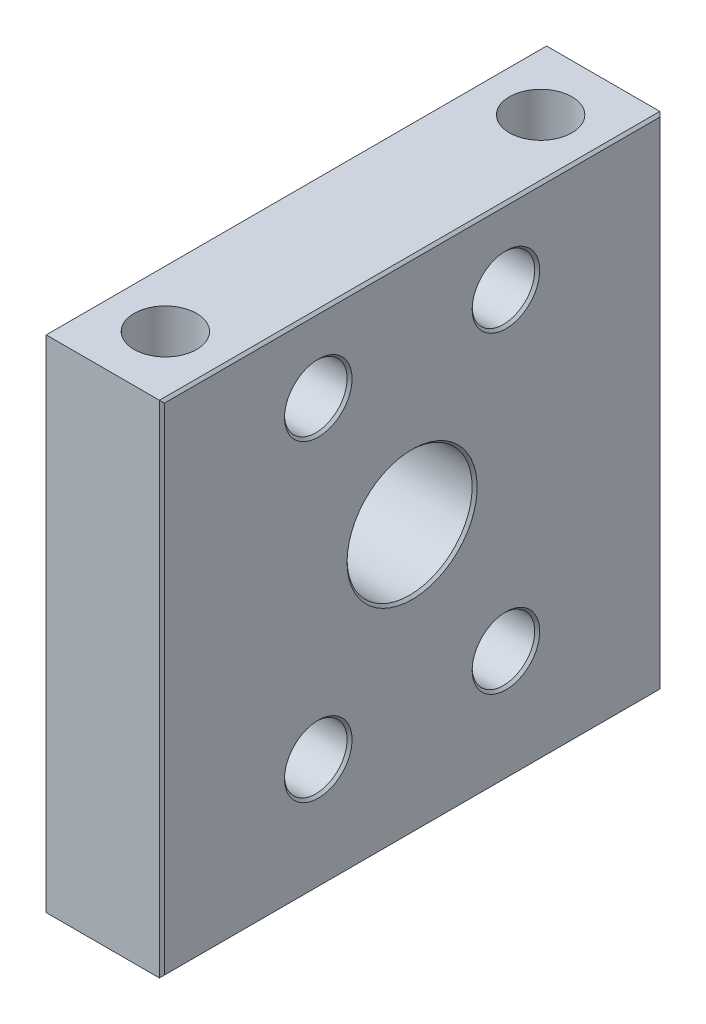
ISO-10303-21;
HEADER;
FILE_DESCRIPTION(('STEP AP214'),'2;1');
FILE_NAME('part.step','',(''),(''),'','','');
FILE_SCHEMA(('AUTOMOTIVE_DESIGN { 1 0 10303 214 1 1 1 1 }'));
ENDSEC;
DATA;
#1=APPLICATION_CONTEXT('core data for automotive mechanical design processes');
#2=APPLICATION_PROTOCOL_DEFINITION('international standard','automotive_design',2000,#1);
#3=PRODUCT_CONTEXT('',#1,'mechanical');
#4=PRODUCT('Part','Part','',(#3));
#5=PRODUCT_RELATED_PRODUCT_CATEGORY('part','',(#4));
#6=PRODUCT_DEFINITION_FORMATION('','',#4);
#7=PRODUCT_DEFINITION_CONTEXT('part definition',#1,'design');
#8=PRODUCT_DEFINITION('design','',#6,#7);
#9=PRODUCT_DEFINITION_SHAPE('','',#8);
#10=(LENGTH_UNIT() NAMED_UNIT(*) SI_UNIT(.MILLI.,.METRE.));
#11=(NAMED_UNIT(*) PLANE_ANGLE_UNIT() SI_UNIT($,.RADIAN.));
#12=(NAMED_UNIT(*) SI_UNIT($,.STERADIAN.) SOLID_ANGLE_UNIT());
#13=UNCERTAINTY_MEASURE_WITH_UNIT(LENGTH_MEASURE(1.E-05),#10,'distance_accuracy_value','');
#14=(GEOMETRIC_REPRESENTATION_CONTEXT(3) GLOBAL_UNCERTAINTY_ASSIGNED_CONTEXT((#13)) GLOBAL_UNIT_ASSIGNED_CONTEXT((#10,
#11,#12)) REPRESENTATION_CONTEXT('',''));
#15=CARTESIAN_POINT('',(0.,0.,0.));
#16=DIRECTION('',(0.,0.,1.));
#17=DIRECTION('',(1.,0.,0.));
#18=AXIS2_PLACEMENT_3D('',#15,#16,#17);
#19=CARTESIAN_POINT('',(0.,50.8,0.));
#20=DIRECTION('',(0.,1.,0.));
#21=DIRECTION('',(0.,0.,1.));
#22=AXIS2_PLACEMENT_3D('',#19,#20,#21);
#23=PLANE('',#22);
#24=CARTESIAN_POINT('',(0.,50.8,-19.05));
#25=DIRECTION('',(0.,1.,0.));
#26=DIRECTION('',(0.,0.,1.));
#27=AXIS2_PLACEMENT_3D('',#24,#25,#26);
#28=CIRCLE('',#27,3.175);
#29=CARTESIAN_POINT('',(0.,50.8,-15.875));
#30=VERTEX_POINT('',#29);
#31=EDGE_CURVE('E245',#30,#30,#28,.T.);
#32=ORIENTED_EDGE('',*,*,#31,.F.);
#33=EDGE_LOOP('',(#32));
#34=FACE_BOUND('',#33,.T.);
#35=DIRECTION('',(-1.,0.,0.));
#36=VECTOR('',#35,1.);
#37=CARTESIAN_POINT('',(6.00095142318896,50.8,-25.4));
#38=LINE('',#37,#36);
#39=CARTESIAN_POINT('',(5.74695142318896,50.8,-25.4));
#40=VERTEX_POINT('',#39);
#41=CARTESIAN_POINT('',(-5.74695142318896,50.8,-25.4));
#42=VERTEX_POINT('',#41);
#43=EDGE_CURVE('E234',#40,#42,#38,.T.);
#44=ORIENTED_EDGE('',*,*,#43,.T.);
#45=DIRECTION('',(0.,0.,1.));
#46=VECTOR('',#45,1.);
#47=CARTESIAN_POINT('',(-5.74695142318896,50.8,25.4));
#48=LINE('',#47,#46);
#49=CARTESIAN_POINT('',(-5.74695142318896,50.8,25.4));
#50=VERTEX_POINT('',#49);
#51=EDGE_CURVE('E145',#42,#50,#48,.T.);
#52=ORIENTED_EDGE('',*,*,#51,.T.);
#53=DIRECTION('',(1.,0.,0.));
#54=VECTOR('',#53,1.);
#55=CARTESIAN_POINT('',(6.00095142318896,50.8,25.4));
#56=LINE('',#55,#54);
#57=CARTESIAN_POINT('',(5.74695142318896,50.8,25.4));
#58=VERTEX_POINT('',#57);
#59=EDGE_CURVE('E240',#50,#58,#56,.T.);
#60=ORIENTED_EDGE('',*,*,#59,.T.);
#61=DIRECTION('',(0.,0.,-1.));
#62=VECTOR('',#61,1.);
#63=CARTESIAN_POINT('',(5.74695142318896,50.8,-25.4));
#64=LINE('',#63,#62);
#65=EDGE_CURVE('E143',#58,#40,#64,.T.);
#66=ORIENTED_EDGE('',*,*,#65,.T.);
#67=EDGE_LOOP('',(#44,#52,#60,#66));
#68=FACE_BOUND('',#67,.T.);
#69=CARTESIAN_POINT('',(0.,50.8,19.05));
#70=DIRECTION('',(0.,1.,0.));
#71=DIRECTION('',(0.,0.,1.));
#72=AXIS2_PLACEMENT_3D('',#69,#70,#71);
#73=CIRCLE('',#72,3.175);
#74=CARTESIAN_POINT('',(0.,50.8,22.225));
#75=VERTEX_POINT('',#74);
#76=EDGE_CURVE('E276',#75,#75,#73,.T.);
#77=ORIENTED_EDGE('',*,*,#76,.F.);
#78=EDGE_LOOP('',(#77));
#79=FACE_BOUND('',#78,.T.);
#80=ADVANCED_FACE('F44',(#34,#68,#79),#23,.T.);
#81=CARTESIAN_POINT('',(0.,0.,0.));
#82=DIRECTION('',(0.,1.,0.));
#83=DIRECTION('',(0.,0.,1.));
#84=AXIS2_PLACEMENT_3D('',#81,#82,#83);
#85=PLANE('',#84);
#86=DIRECTION('',(1.,0.,0.));
#87=VECTOR('',#86,1.);
#88=CARTESIAN_POINT('',(6.00095142318896,0.,25.4));
#89=LINE('',#88,#87);
#90=CARTESIAN_POINT('',(-5.74695142318896,0.,25.4));
#91=VERTEX_POINT('',#90);
#92=CARTESIAN_POINT('',(5.74695142318896,0.,25.4));
#93=VERTEX_POINT('',#92);
#94=EDGE_CURVE('E241',#91,#93,#89,.T.);
#95=ORIENTED_EDGE('',*,*,#94,.F.);
#96=DIRECTION('',(0.,0.,-1.));
#97=VECTOR('',#96,1.);
#98=CARTESIAN_POINT('',(-5.74695142318896,0.,0.));
#99=LINE('',#98,#97);
#100=CARTESIAN_POINT('',(-5.74695142318896,0.,-25.4));
#101=VERTEX_POINT('',#100);
#102=EDGE_CURVE('E154',#91,#101,#99,.T.);
#103=ORIENTED_EDGE('',*,*,#102,.T.);
#104=DIRECTION('',(-1.,0.,0.));
#105=VECTOR('',#104,1.);
#106=CARTESIAN_POINT('',(6.00095142318896,0.,-25.4));
#107=LINE('',#106,#105);
#108=CARTESIAN_POINT('',(5.74695142318896,0.,-25.4));
#109=VERTEX_POINT('',#108);
#110=EDGE_CURVE('E232',#109,#101,#107,.T.);
#111=ORIENTED_EDGE('',*,*,#110,.F.);
#112=DIRECTION('',(0.,0.,1.));
#113=VECTOR('',#112,1.);
#114=CARTESIAN_POINT('',(5.74695142318896,0.,0.));
#115=LINE('',#114,#113);
#116=EDGE_CURVE('E152',#109,#93,#115,.T.);
#117=ORIENTED_EDGE('',*,*,#116,.T.);
#118=EDGE_LOOP('',(#95,#103,#111,#117));
#119=FACE_BOUND('',#118,.T.);
#120=CARTESIAN_POINT('',(0.,0.,-19.05));
#121=DIRECTION('',(0.,1.,0.));
#122=DIRECTION('',(0.,0.,1.));
#123=AXIS2_PLACEMENT_3D('',#120,#121,#122);
#124=CIRCLE('',#123,3.175);
#125=CARTESIAN_POINT('',(0.,0.,-15.875));
#126=VERTEX_POINT('',#125);
#127=EDGE_CURVE('E273',#126,#126,#124,.T.);
#128=ORIENTED_EDGE('',*,*,#127,.T.);
#129=EDGE_LOOP('',(#128));
#130=FACE_BOUND('',#129,.T.);
#131=CARTESIAN_POINT('',(0.,0.,19.05));
#132=DIRECTION('',(0.,1.,0.));
#133=DIRECTION('',(0.,0.,1.));
#134=AXIS2_PLACEMENT_3D('',#131,#132,#133);
#135=CIRCLE('',#134,3.175);
#136=CARTESIAN_POINT('',(0.,0.,22.225));
#137=VERTEX_POINT('',#136);
#138=EDGE_CURVE('E210',#137,#137,#135,.T.);
#139=ORIENTED_EDGE('',*,*,#138,.T.);
#140=EDGE_LOOP('',(#139));
#141=FACE_BOUND('',#140,.T.);
#142=ADVANCED_FACE('F237',(#119,#130,#141),#85,.F.);
#143=CARTESIAN_POINT('',(-6.00095142318896,50.8,25.4));
#144=DIRECTION('',(1.,0.,0.));
#145=DIRECTION('',(0.,0.,-1.));
#146=AXIS2_PLACEMENT_3D('',#143,#144,#145);
#147=PLANE('',#146);
#148=DIRECTION('',(0.,0.,-1.));
#149=VECTOR('',#148,1.);
#150=CARTESIAN_POINT('',(-6.00095142318896,50.546,-25.4));
#151=LINE('',#150,#149);
#152=CARTESIAN_POINT('',(-6.00095142318896,50.546,25.146));
#153=VERTEX_POINT('',#152);
#154=CARTESIAN_POINT('',(-6.00095142318896,50.546,-25.146));
#155=VERTEX_POINT('',#154);
#156=EDGE_CURVE('E134',#153,#155,#151,.T.);
#157=ORIENTED_EDGE('',*,*,#156,.T.);
#158=DIRECTION('',(0.,-1.,0.));
#159=VECTOR('',#158,1.);
#160=CARTESIAN_POINT('',(-6.00095142318896,50.8,-25.146));
#161=LINE('',#160,#159);
#162=CARTESIAN_POINT('',(-6.00095142318896,0.254000000000004,-25.146));
#163=VERTEX_POINT('',#162);
#164=EDGE_CURVE('E114',#155,#163,#161,.T.);
#165=ORIENTED_EDGE('',*,*,#164,.T.);
#166=DIRECTION('',(0.,0.,1.));
#167=VECTOR('',#166,1.);
#168=CARTESIAN_POINT('',(-6.00095142318896,0.254000000000004,25.4));
#169=LINE('',#168,#167);
#170=CARTESIAN_POINT('',(-6.00095142318896,0.254000000000004,25.146));
#171=VERTEX_POINT('',#170);
#172=EDGE_CURVE('E122',#163,#171,#169,.T.);
#173=ORIENTED_EDGE('',*,*,#172,.T.);
#174=DIRECTION('',(0.,1.,0.));
#175=VECTOR('',#174,1.);
#176=CARTESIAN_POINT('',(-6.00095142318896,50.8,25.146));
#177=LINE('',#176,#175);
#178=EDGE_CURVE('E128',#171,#153,#177,.T.);
#179=ORIENTED_EDGE('',*,*,#178,.T.);
#180=EDGE_LOOP('',(#157,#165,#173,#179));
#181=FACE_BOUND('',#180,.T.);
#182=CARTESIAN_POINT('',(-6.00095142318896,43.18,9.525));
#183=DIRECTION('',(1.,0.,0.));
#184=DIRECTION('',(0.,0.,-1.));
#185=AXIS2_PLACEMENT_3D('',#182,#183,#184);
#186=CIRCLE('',#185,3.42899999999999);
#187=CARTESIAN_POINT('',(-6.00095142318896,43.18,6.09600000000002));
#188=VERTEX_POINT('',#187);
#189=EDGE_CURVE('E129',#188,#188,#186,.T.);
#190=ORIENTED_EDGE('',*,*,#189,.T.);
#191=EDGE_LOOP('',(#190));
#192=FACE_BOUND('',#191,.T.);
#193=CARTESIAN_POINT('',(-6.00095142318896,43.18,-9.525));
#194=DIRECTION('',(1.,0.,0.));
#195=DIRECTION('',(0.,0.,-1.));
#196=AXIS2_PLACEMENT_3D('',#193,#194,#195);
#197=CIRCLE('',#196,3.42900000000001);
#198=CARTESIAN_POINT('',(-6.00095142318896,43.18,-12.954));
#199=VERTEX_POINT('',#198);
#200=EDGE_CURVE('E258',#199,#199,#197,.T.);
#201=ORIENTED_EDGE('',*,*,#200,.T.);
#202=EDGE_LOOP('',(#201));
#203=FACE_BOUND('',#202,.T.);
#204=CARTESIAN_POINT('',(-6.00095142318896,27.305,0.));
#205=DIRECTION('',(1.,0.,0.));
#206=DIRECTION('',(0.,0.,-1.));
#207=AXIS2_PLACEMENT_3D('',#204,#205,#206);
#208=CIRCLE('',#207,6.60399999999999);
#209=CARTESIAN_POINT('',(-6.00095142318896,27.305,-6.60399999999999));
#210=VERTEX_POINT('',#209);
#211=EDGE_CURVE('E255',#210,#210,#208,.T.);
#212=ORIENTED_EDGE('',*,*,#211,.T.);
#213=EDGE_LOOP('',(#212));
#214=FACE_BOUND('',#213,.T.);
#215=CARTESIAN_POINT('',(-6.00095142318896,11.43,9.525));
#216=DIRECTION('',(1.,0.,0.));
#217=DIRECTION('',(0.,0.,-1.));
#218=AXIS2_PLACEMENT_3D('',#215,#216,#217);
#219=CIRCLE('',#218,3.42900000000001);
#220=CARTESIAN_POINT('',(-6.00095142318896,11.43,6.09599999999999));
#221=VERTEX_POINT('',#220);
#222=EDGE_CURVE('E252',#221,#221,#219,.T.);
#223=ORIENTED_EDGE('',*,*,#222,.T.);
#224=EDGE_LOOP('',(#223));
#225=FACE_BOUND('',#224,.T.);
#226=CARTESIAN_POINT('',(-6.00095142318896,11.43,-9.52499999999999));
#227=DIRECTION('',(1.,0.,0.));
#228=DIRECTION('',(0.,0.,-1.));
#229=AXIS2_PLACEMENT_3D('',#226,#227,#228);
#230=CIRCLE('',#229,3.42899999999999);
#231=CARTESIAN_POINT('',(-6.00095142318896,11.43,-12.954));
#232=VERTEX_POINT('',#231);
#233=EDGE_CURVE('E249',#232,#232,#230,.T.);
#234=ORIENTED_EDGE('',*,*,#233,.T.);
#235=EDGE_LOOP('',(#234));
#236=FACE_BOUND('',#235,.T.);
#237=ADVANCED_FACE('F131',(#181,#192,#203,#214,#225,#236),#147,.F.);
#238=CARTESIAN_POINT('',(6.00095142318896,50.8,25.4));
#239=DIRECTION('',(0.,0.,-1.));
#240=DIRECTION('',(-1.,0.,0.));
#241=AXIS2_PLACEMENT_3D('',#238,#239,#240);
#242=PLANE('',#241);
#243=ORIENTED_EDGE('',*,*,#59,.F.);
#244=DIRECTION('',(0.,-1.,0.));
#245=VECTOR('',#244,1.);
#246=CARTESIAN_POINT('',(-5.74695142318896,50.8,25.4));
#247=LINE('',#246,#245);
#248=EDGE_CURVE('E150',#50,#91,#247,.T.);
#249=ORIENTED_EDGE('',*,*,#248,.T.);
#250=ORIENTED_EDGE('',*,*,#94,.T.);
#251=DIRECTION('',(0.,1.,0.));
#252=VECTOR('',#251,1.);
#253=CARTESIAN_POINT('',(5.74695142318896,50.8,25.4));
#254=LINE('',#253,#252);
#255=EDGE_CURVE('E147',#93,#58,#254,.T.);
#256=ORIENTED_EDGE('',*,*,#255,.T.);
#257=EDGE_LOOP('',(#243,#249,#250,#256));
#258=FACE_BOUND('',#257,.T.);
#259=ADVANCED_FACE('F303',(#258),#242,.F.);
#260=CARTESIAN_POINT('',(6.00095142318896,50.8,25.4));
#261=DIRECTION('',(-1.,0.,0.));
#262=DIRECTION('',(0.,0.,1.));
#263=AXIS2_PLACEMENT_3D('',#260,#261,#262);
#264=PLANE('',#263);
#265=DIRECTION('',(0.,0.,1.));
#266=VECTOR('',#265,1.);
#267=CARTESIAN_POINT('',(6.00095142318896,50.546,25.4));
#268=LINE('',#267,#266);
#269=CARTESIAN_POINT('',(6.00095142318896,50.546,-25.146));
#270=VERTEX_POINT('',#269);
#271=CARTESIAN_POINT('',(6.00095142318896,50.546,25.146));
#272=VERTEX_POINT('',#271);
#273=EDGE_CURVE('E53',#270,#272,#268,.T.);
#274=ORIENTED_EDGE('',*,*,#273,.T.);
#275=DIRECTION('',(0.,-1.,0.));
#276=VECTOR('',#275,1.);
#277=CARTESIAN_POINT('',(6.00095142318896,50.8,25.146));
#278=LINE('',#277,#276);
#279=CARTESIAN_POINT('',(6.00095142318896,0.254000000000004,25.146));
#280=VERTEX_POINT('',#279);
#281=EDGE_CURVE('E13',#272,#280,#278,.T.);
#282=ORIENTED_EDGE('',*,*,#281,.T.);
#283=DIRECTION('',(0.,0.,-1.));
#284=VECTOR('',#283,1.);
#285=CARTESIAN_POINT('',(6.00095142318896,0.254000000000004,25.4));
#286=LINE('',#285,#284);
#287=CARTESIAN_POINT('',(6.00095142318896,0.254000000000004,-25.146));
#288=VERTEX_POINT('',#287);
#289=EDGE_CURVE('E201',#280,#288,#286,.T.);
#290=ORIENTED_EDGE('',*,*,#289,.T.);
#291=DIRECTION('',(0.,1.,0.));
#292=VECTOR('',#291,1.);
#293=CARTESIAN_POINT('',(6.00095142318896,50.8,-25.146));
#294=LINE('',#293,#292);
#295=EDGE_CURVE('E64',#288,#270,#294,.T.);
#296=ORIENTED_EDGE('',*,*,#295,.T.);
#297=EDGE_LOOP('',(#274,#282,#290,#296));
#298=FACE_BOUND('',#297,.T.);
#299=CARTESIAN_POINT('',(6.00095142318896,43.18,9.525));
#300=DIRECTION('',(-1.,0.,0.));
#301=DIRECTION('',(0.,0.,1.));
#302=AXIS2_PLACEMENT_3D('',#299,#300,#301);
#303=CIRCLE('',#302,3.42899999999999);
#304=CARTESIAN_POINT('',(6.00095142318896,43.18,12.954));
#305=VERTEX_POINT('',#304);
#306=EDGE_CURVE('E198',#305,#305,#303,.T.);
#307=ORIENTED_EDGE('',*,*,#306,.T.);
#308=EDGE_LOOP('',(#307));
#309=FACE_BOUND('',#308,.T.);
#310=CARTESIAN_POINT('',(6.00095142318896,43.18,-9.525));
#311=DIRECTION('',(-1.,0.,0.));
#312=DIRECTION('',(0.,0.,1.));
#313=AXIS2_PLACEMENT_3D('',#310,#311,#312);
#314=CIRCLE('',#313,3.42899999999999);
#315=CARTESIAN_POINT('',(6.00095142318896,43.18,-6.09600000000001));
#316=VERTEX_POINT('',#315);
#317=EDGE_CURVE('E195',#316,#316,#314,.T.);
#318=ORIENTED_EDGE('',*,*,#317,.T.);
#319=EDGE_LOOP('',(#318));
#320=FACE_BOUND('',#319,.T.);
#321=CARTESIAN_POINT('',(6.00095142318896,27.305,0.));
#322=DIRECTION('',(-1.,0.,0.));
#323=DIRECTION('',(0.,0.,1.));
#324=AXIS2_PLACEMENT_3D('',#321,#322,#323);
#325=CIRCLE('',#324,6.604);
#326=CARTESIAN_POINT('',(6.00095142318896,27.305,6.604));
#327=VERTEX_POINT('',#326);
#328=EDGE_CURVE('E192',#327,#327,#325,.T.);
#329=ORIENTED_EDGE('',*,*,#328,.T.);
#330=EDGE_LOOP('',(#329));
#331=FACE_BOUND('',#330,.T.);
#332=CARTESIAN_POINT('',(6.00095142318896,11.43,9.525));
#333=DIRECTION('',(-1.,0.,0.));
#334=DIRECTION('',(0.,0.,1.));
#335=AXIS2_PLACEMENT_3D('',#332,#333,#334);
#336=CIRCLE('',#335,3.42899999999999);
#337=CARTESIAN_POINT('',(6.00095142318896,11.43,12.954));
#338=VERTEX_POINT('',#337);
#339=EDGE_CURVE('E189',#338,#338,#336,.T.);
#340=ORIENTED_EDGE('',*,*,#339,.T.);
#341=EDGE_LOOP('',(#340));
#342=FACE_BOUND('',#341,.T.);
#343=CARTESIAN_POINT('',(6.00095142318896,11.43,-9.52499999999999));
#344=DIRECTION('',(-1.,0.,0.));
#345=DIRECTION('',(0.,0.,1.));
#346=AXIS2_PLACEMENT_3D('',#343,#344,#345);
#347=CIRCLE('',#346,3.42899999999999);
#348=CARTESIAN_POINT('',(6.00095142318896,11.43,-6.096));
#349=VERTEX_POINT('',#348);
#350=EDGE_CURVE('E186',#349,#349,#347,.T.);
#351=ORIENTED_EDGE('',*,*,#350,.T.);
#352=EDGE_LOOP('',(#351));
#353=FACE_BOUND('',#352,.T.);
#354=ADVANCED_FACE('F300',(#298,#309,#320,#331,#342,#353),#264,.F.);
#355=CARTESIAN_POINT('',(6.00095142318896,50.8,-25.4));
#356=DIRECTION('',(0.,0.,1.));
#357=DIRECTION('',(1.,0.,0.));
#358=AXIS2_PLACEMENT_3D('',#355,#356,#357);
#359=PLANE('',#358);
#360=ORIENTED_EDGE('',*,*,#110,.T.);
#361=DIRECTION('',(0.,1.,0.));
#362=VECTOR('',#361,1.);
#363=CARTESIAN_POINT('',(-5.74695142318896,50.8,-25.4));
#364=LINE('',#363,#362);
#365=EDGE_CURVE('E116',#101,#42,#364,.T.);
#366=ORIENTED_EDGE('',*,*,#365,.T.);
#367=ORIENTED_EDGE('',*,*,#43,.F.);
#368=DIRECTION('',(0.,-1.,0.));
#369=VECTOR('',#368,1.);
#370=CARTESIAN_POINT('',(5.74695142318896,50.8,-25.4));
#371=LINE('',#370,#369);
#372=EDGE_CURVE('E136',#40,#109,#371,.T.);
#373=ORIENTED_EDGE('',*,*,#372,.T.);
#374=EDGE_LOOP('',(#360,#366,#367,#373));
#375=FACE_BOUND('',#374,.T.);
#376=ADVANCED_FACE('F231',(#375),#359,.F.);
#377=CARTESIAN_POINT('',(0.,50.8,-19.05));
#378=DIRECTION('',(0.,-1.,0.));
#379=DIRECTION('',(0.,0.,-1.));
#380=AXIS2_PLACEMENT_3D('',#377,#378,#379);
#381=CYLINDRICAL_SURFACE('',#380,3.175);
#382=ORIENTED_EDGE('',*,*,#31,.T.);
#383=EDGE_LOOP('',(#382));
#384=FACE_BOUND('',#383,.T.);
#385=ORIENTED_EDGE('',*,*,#127,.F.);
#386=EDGE_LOOP('',(#385));
#387=FACE_BOUND('',#386,.T.);
#388=ADVANCED_FACE('F295',(#384,#387),#381,.F.);
#389=CARTESIAN_POINT('',(0.,50.8,19.05));
#390=DIRECTION('',(0.,-1.,0.));
#391=DIRECTION('',(0.,0.,-1.));
#392=AXIS2_PLACEMENT_3D('',#389,#390,#391);
#393=CYLINDRICAL_SURFACE('',#392,3.175);
#394=ORIENTED_EDGE('',*,*,#76,.T.);
#395=EDGE_LOOP('',(#394));
#396=FACE_BOUND('',#395,.T.);
#397=ORIENTED_EDGE('',*,*,#138,.F.);
#398=EDGE_LOOP('',(#397));
#399=FACE_BOUND('',#398,.T.);
#400=ADVANCED_FACE('F284',(#396,#399),#393,.F.);
#401=CARTESIAN_POINT('',(-44.799048576811,43.18,9.525));
#402=DIRECTION('',(1.,0.,0.));
#403=DIRECTION('',(0.,0.,-1.));
#404=AXIS2_PLACEMENT_3D('',#401,#402,#403);
#405=CYLINDRICAL_SURFACE('',#404,3.175);
#406=CARTESIAN_POINT('',(-5.74695142318896,43.18,9.525));
#407=DIRECTION('',(1.,0.,0.));
#408=DIRECTION('',(0.,0.,-1.));
#409=AXIS2_PLACEMENT_3D('',#406,#407,#408);
#410=CIRCLE('',#409,3.175);
#411=CARTESIAN_POINT('',(-5.74695142318896,43.18,6.35));
#412=VERTEX_POINT('',#411);
#413=EDGE_CURVE('E159',#412,#412,#410,.F.);
#414=ORIENTED_EDGE('',*,*,#413,.T.);
#415=EDGE_LOOP('',(#414));
#416=FACE_BOUND('',#415,.T.);
#417=CARTESIAN_POINT('',(5.74695142318897,43.18,9.525));
#418=DIRECTION('',(-1.,0.,0.));
#419=DIRECTION('',(0.,0.,1.));
#420=AXIS2_PLACEMENT_3D('',#417,#418,#419);
#421=CIRCLE('',#420,3.175);
#422=CARTESIAN_POINT('',(5.74695142318897,43.18,12.7));
#423=VERTEX_POINT('',#422);
#424=EDGE_CURVE('E156',#423,#423,#421,.F.);
#425=ORIENTED_EDGE('',*,*,#424,.T.);
#426=EDGE_LOOP('',(#425));
#427=FACE_BOUND('',#426,.T.);
#428=ADVANCED_FACE('F387',(#416,#427),#405,.F.);
#429=CARTESIAN_POINT('',(-44.799048576811,43.18,-9.525));
#430=DIRECTION('',(1.,0.,0.));
#431=DIRECTION('',(0.,0.,-1.));
#432=AXIS2_PLACEMENT_3D('',#429,#430,#431);
#433=CYLINDRICAL_SURFACE('',#432,3.175);
#434=CARTESIAN_POINT('',(-5.74695142318895,43.18,-9.525));
#435=DIRECTION('',(1.,0.,0.));
#436=DIRECTION('',(0.,0.,-1.));
#437=AXIS2_PLACEMENT_3D('',#434,#435,#436);
#438=CIRCLE('',#437,3.175);
#439=CARTESIAN_POINT('',(-5.74695142318895,43.18,-12.7));
#440=VERTEX_POINT('',#439);
#441=EDGE_CURVE('E165',#440,#440,#438,.F.);
#442=ORIENTED_EDGE('',*,*,#441,.T.);
#443=EDGE_LOOP('',(#442));
#444=FACE_BOUND('',#443,.T.);
#445=CARTESIAN_POINT('',(5.74695142318897,43.18,-9.525));
#446=DIRECTION('',(-1.,0.,0.));
#447=DIRECTION('',(0.,0.,1.));
#448=AXIS2_PLACEMENT_3D('',#445,#446,#447);
#449=CIRCLE('',#448,3.175);
#450=CARTESIAN_POINT('',(5.74695142318897,43.18,-6.35));
#451=VERTEX_POINT('',#450);
#452=EDGE_CURVE('E162',#451,#451,#449,.F.);
#453=ORIENTED_EDGE('',*,*,#452,.T.);
#454=EDGE_LOOP('',(#453));
#455=FACE_BOUND('',#454,.T.);
#456=ADVANCED_FACE('F382',(#444,#455),#433,.F.);
#457=CARTESIAN_POINT('',(-44.799048576811,27.305,0.));
#458=DIRECTION('',(1.,0.,0.));
#459=DIRECTION('',(0.,0.,-1.));
#460=AXIS2_PLACEMENT_3D('',#457,#458,#459);
#461=CYLINDRICAL_SURFACE('',#460,6.35);
#462=CARTESIAN_POINT('',(-5.74695142318898,27.305,0.));
#463=DIRECTION('',(1.,0.,0.));
#464=DIRECTION('',(0.,0.,-1.));
#465=AXIS2_PLACEMENT_3D('',#462,#463,#464);
#466=CIRCLE('',#465,6.35);
#467=CARTESIAN_POINT('',(-5.74695142318898,27.305,-6.35));
#468=VERTEX_POINT('',#467);
#469=EDGE_CURVE('E171',#468,#468,#466,.F.);
#470=ORIENTED_EDGE('',*,*,#469,.T.);
#471=EDGE_LOOP('',(#470));
#472=FACE_BOUND('',#471,.T.);
#473=CARTESIAN_POINT('',(5.74695142318896,27.305,0.));
#474=DIRECTION('',(-1.,0.,0.));
#475=DIRECTION('',(0.,0.,1.));
#476=AXIS2_PLACEMENT_3D('',#473,#474,#475);
#477=CIRCLE('',#476,6.35);
#478=CARTESIAN_POINT('',(5.74695142318896,27.305,6.35));
#479=VERTEX_POINT('',#478);
#480=EDGE_CURVE('E168',#479,#479,#477,.F.);
#481=ORIENTED_EDGE('',*,*,#480,.T.);
#482=EDGE_LOOP('',(#481));
#483=FACE_BOUND('',#482,.T.);
#484=ADVANCED_FACE('F373',(#472,#483),#461,.F.);
#485=CARTESIAN_POINT('',(-44.799048576811,11.43,9.525));
#486=DIRECTION('',(1.,0.,0.));
#487=DIRECTION('',(0.,0.,-1.));
#488=AXIS2_PLACEMENT_3D('',#485,#486,#487);
#489=CYLINDRICAL_SURFACE('',#488,3.175);
#490=CARTESIAN_POINT('',(-5.74695142318895,11.43,9.525));
#491=DIRECTION('',(1.,0.,0.));
#492=DIRECTION('',(0.,0.,-1.));
#493=AXIS2_PLACEMENT_3D('',#490,#491,#492);
#494=CIRCLE('',#493,3.175);
#495=CARTESIAN_POINT('',(-5.74695142318895,11.43,6.34999999999999));
#496=VERTEX_POINT('',#495);
#497=EDGE_CURVE('E177',#496,#496,#494,.F.);
#498=ORIENTED_EDGE('',*,*,#497,.T.);
#499=EDGE_LOOP('',(#498));
#500=FACE_BOUND('',#499,.T.);
#501=CARTESIAN_POINT('',(5.74695142318897,11.43,9.525));
#502=DIRECTION('',(-1.,0.,0.));
#503=DIRECTION('',(0.,0.,1.));
#504=AXIS2_PLACEMENT_3D('',#501,#502,#503);
#505=CIRCLE('',#504,3.175);
#506=CARTESIAN_POINT('',(5.74695142318897,11.43,12.7));
#507=VERTEX_POINT('',#506);
#508=EDGE_CURVE('E174',#507,#507,#505,.F.);
#509=ORIENTED_EDGE('',*,*,#508,.T.);
#510=EDGE_LOOP('',(#509));
#511=FACE_BOUND('',#510,.T.);
#512=ADVANCED_FACE('F371',(#500,#511),#489,.F.);
#513=CARTESIAN_POINT('',(-44.799048576811,11.43,-9.52499999999999));
#514=DIRECTION('',(1.,0.,0.));
#515=DIRECTION('',(0.,0.,-1.));
#516=AXIS2_PLACEMENT_3D('',#513,#514,#515);
#517=CYLINDRICAL_SURFACE('',#516,3.175);
#518=CARTESIAN_POINT('',(-5.74695142318897,11.43,-9.52499999999999));
#519=DIRECTION('',(1.,0.,0.));
#520=DIRECTION('',(0.,0.,-1.));
#521=AXIS2_PLACEMENT_3D('',#518,#519,#520);
#522=CIRCLE('',#521,3.175);
#523=CARTESIAN_POINT('',(-5.74695142318897,11.43,-12.7));
#524=VERTEX_POINT('',#523);
#525=EDGE_CURVE('E183',#524,#524,#522,.F.);
#526=ORIENTED_EDGE('',*,*,#525,.T.);
#527=EDGE_LOOP('',(#526));
#528=FACE_BOUND('',#527,.T.);
#529=CARTESIAN_POINT('',(5.74695142318897,11.43,-9.52499999999999));
#530=DIRECTION('',(-1.,0.,0.));
#531=DIRECTION('',(0.,0.,1.));
#532=AXIS2_PLACEMENT_3D('',#529,#530,#531);
#533=CIRCLE('',#532,3.175);
#534=CARTESIAN_POINT('',(5.74695142318897,11.43,-6.34999999999999));
#535=VERTEX_POINT('',#534);
#536=EDGE_CURVE('E180',#535,#535,#533,.F.);
#537=ORIENTED_EDGE('',*,*,#536,.T.);
#538=EDGE_LOOP('',(#537));
#539=FACE_BOUND('',#538,.T.);
#540=ADVANCED_FACE('F318',(#528,#539),#517,.F.);
#541=CARTESIAN_POINT('',(-5.74695142318896,50.8,25.4));
#542=DIRECTION('',(0.707106781186557,0.,-0.707106781186538));
#543=DIRECTION('',(0.,-1.,0.));
#544=AXIS2_PLACEMENT_3D('',#541,#542,#543);
#545=PLANE('',#544);
#546=DIRECTION('',(-0.577350269189615,0.577350269189631,-0.577350269189631));
#547=VECTOR('',#546,1.);
#548=CARTESIAN_POINT('',(-5.91628475652229,0.169333333333335,25.2306666666667));
#549=LINE('',#548,#547);
#550=EDGE_CURVE('E125',#91,#171,#549,.T.);
#551=ORIENTED_EDGE('',*,*,#550,.F.);
#552=ORIENTED_EDGE('',*,*,#248,.F.);
#553=DIRECTION('',(0.577350269189615,0.577350269189631,0.577350269189631));
#554=VECTOR('',#553,1.);
#555=CARTESIAN_POINT('',(-5.74695142318896,50.8,25.4));
#556=LINE('',#555,#554);
#557=EDGE_CURVE('E207',#153,#50,#556,.T.);
#558=ORIENTED_EDGE('',*,*,#557,.F.);
#559=ORIENTED_EDGE('',*,*,#178,.F.);
#560=EDGE_LOOP('',(#551,#552,#558,#559));
#561=FACE_BOUND('',#560,.T.);
#562=ADVANCED_FACE('F265',(#561),#545,.F.);
#563=CARTESIAN_POINT('',(-5.74695142318896,50.8,0.));
#564=DIRECTION('',(-0.707106781186557,0.707106781186538,0.));
#565=DIRECTION('',(0.,0.,-1.));
#566=AXIS2_PLACEMENT_3D('',#563,#564,#565);
#567=PLANE('',#566);
#568=ORIENTED_EDGE('',*,*,#557,.T.);
#569=ORIENTED_EDGE('',*,*,#51,.F.);
#570=DIRECTION('',(0.577350269189612,0.577350269189628,-0.577350269189638));
#571=VECTOR('',#570,1.);
#572=CARTESIAN_POINT('',(-14.2136180898556,42.3333333333331,-16.933333333333));
#573=LINE('',#572,#571);
#574=EDGE_CURVE('E119',#155,#42,#573,.T.);
#575=ORIENTED_EDGE('',*,*,#574,.F.);
#576=ORIENTED_EDGE('',*,*,#156,.F.);
#577=EDGE_LOOP('',(#568,#569,#575,#576));
#578=FACE_BOUND('',#577,.T.);
#579=ADVANCED_FACE('F268',(#578),#567,.T.);
#580=CARTESIAN_POINT('',(-6.00095142318896,0.254000000000004,25.4));
#581=DIRECTION('',(0.707106781186557,0.707106781186538,0.));
#582=DIRECTION('',(0.,0.,1.));
#583=AXIS2_PLACEMENT_3D('',#580,#581,#582);
#584=PLANE('',#583);
#585=ORIENTED_EDGE('',*,*,#550,.T.);
#586=ORIENTED_EDGE('',*,*,#172,.F.);
#587=DIRECTION('',(0.577350269189612,-0.577350269189628,-0.577350269189638));
#588=VECTOR('',#587,1.);
#589=CARTESIAN_POINT('',(-22.8496180898556,17.1026666666671,-8.29733333333265));
#590=LINE('',#589,#588);
#591=EDGE_CURVE('E110',#101,#163,#590,.F.);
#592=ORIENTED_EDGE('',*,*,#591,.F.);
#593=ORIENTED_EDGE('',*,*,#102,.F.);
#594=EDGE_LOOP('',(#585,#586,#592,#593));
#595=FACE_BOUND('',#594,.T.);
#596=ADVANCED_FACE('F123',(#595),#584,.F.);
#597=CARTESIAN_POINT('',(-6.00095142318896,50.8,-25.146));
#598=DIRECTION('',(0.707106781186563,0.,0.707106781186532));
#599=DIRECTION('',(0.,-1.,0.));
#600=AXIS2_PLACEMENT_3D('',#597,#598,#599);
#601=PLANE('',#600);
#602=ORIENTED_EDGE('',*,*,#574,.T.);
#603=ORIENTED_EDGE('',*,*,#365,.F.);
#604=ORIENTED_EDGE('',*,*,#591,.T.);
#605=ORIENTED_EDGE('',*,*,#164,.F.);
#606=EDGE_LOOP('',(#602,#603,#604,#605));
#607=FACE_BOUND('',#606,.T.);
#608=ADVANCED_FACE('F112',(#607),#601,.F.);
#609=CARTESIAN_POINT('',(-6.00095142318896,43.18,9.525));
#610=DIRECTION('',(-1.,0.,0.));
#611=DIRECTION('',(0.,0.,1.));
#612=AXIS2_PLACEMENT_3D('',#609,#610,#611);
#613=CONICAL_SURFACE('',#612,3.42899999999999,0.785398163397427);
#614=ORIENTED_EDGE('',*,*,#413,.F.);
#615=EDGE_LOOP('',(#614));
#616=FACE_BOUND('',#615,.T.);
#617=ORIENTED_EDGE('',*,*,#189,.F.);
#618=EDGE_LOOP('',(#617));
#619=FACE_BOUND('',#618,.T.);
#620=ADVANCED_FACE('F311',(#616,#619),#613,.F.);
#621=CARTESIAN_POINT('',(-6.00095142318896,43.18,-9.525));
#622=DIRECTION('',(-1.,0.,0.));
#623=DIRECTION('',(0.,0.,1.));
#624=AXIS2_PLACEMENT_3D('',#621,#622,#623);
#625=CONICAL_SURFACE('',#624,3.42900000000001,0.785398163397441);
#626=ORIENTED_EDGE('',*,*,#441,.F.);
#627=EDGE_LOOP('',(#626));
#628=FACE_BOUND('',#627,.T.);
#629=ORIENTED_EDGE('',*,*,#200,.F.);
#630=EDGE_LOOP('',(#629));
#631=FACE_BOUND('',#630,.T.);
#632=ADVANCED_FACE('F321',(#628,#631),#625,.F.);
#633=CARTESIAN_POINT('',(-6.00095142318896,27.305,0.));
#634=DIRECTION('',(-1.,0.,0.));
#635=DIRECTION('',(0.,0.,1.));
#636=AXIS2_PLACEMENT_3D('',#633,#634,#635);
#637=CONICAL_SURFACE('',#636,6.60399999999999,0.785398163397465);
#638=ORIENTED_EDGE('',*,*,#469,.F.);
#639=EDGE_LOOP('',(#638));
#640=FACE_BOUND('',#639,.T.);
#641=ORIENTED_EDGE('',*,*,#211,.F.);
#642=EDGE_LOOP('',(#641));
#643=FACE_BOUND('',#642,.T.);
#644=ADVANCED_FACE('F325',(#640,#643),#637,.F.);
#645=CARTESIAN_POINT('',(-6.00095142318896,11.43,9.525));
#646=DIRECTION('',(-1.,0.,0.));
#647=DIRECTION('',(0.,0.,1.));
#648=AXIS2_PLACEMENT_3D('',#645,#646,#647);
#649=CONICAL_SURFACE('',#648,3.42900000000001,0.785398163397442);
#650=ORIENTED_EDGE('',*,*,#497,.F.);
#651=EDGE_LOOP('',(#650));
#652=FACE_BOUND('',#651,.T.);
#653=ORIENTED_EDGE('',*,*,#222,.F.);
#654=EDGE_LOOP('',(#653));
#655=FACE_BOUND('',#654,.T.);
#656=ADVANCED_FACE('F329',(#652,#655),#649,.F.);
#657=CARTESIAN_POINT('',(-6.00095142318896,11.43,-9.52499999999999));
#658=DIRECTION('',(-1.,0.,0.));
#659=DIRECTION('',(0.,0.,1.));
#660=AXIS2_PLACEMENT_3D('',#657,#658,#659);
#661=CONICAL_SURFACE('',#660,3.429,0.785398163397456);
#662=ORIENTED_EDGE('',*,*,#525,.F.);
#663=EDGE_LOOP('',(#662));
#664=FACE_BOUND('',#663,.T.);
#665=ORIENTED_EDGE('',*,*,#233,.F.);
#666=EDGE_LOOP('',(#665));
#667=FACE_BOUND('',#666,.T.);
#668=ADVANCED_FACE('F333',(#664,#667),#661,.F.);
#669=CARTESIAN_POINT('',(5.74695142318896,50.8,-25.4));
#670=DIRECTION('',(-0.707106781186562,0.,0.707106781186533));
#671=DIRECTION('',(0.,-1.,0.));
#672=AXIS2_PLACEMENT_3D('',#669,#670,#671);
#673=PLANE('',#672);
#674=DIRECTION('',(0.577350269189612,0.577350269189629,0.577350269189636));
#675=VECTOR('',#674,1.);
#676=CARTESIAN_POINT('',(22.8496180898555,17.1026666666671,-8.29733333333274));
#677=LINE('',#676,#675);
#678=EDGE_CURVE('E214',#109,#288,#677,.T.);
#679=ORIENTED_EDGE('',*,*,#678,.F.);
#680=ORIENTED_EDGE('',*,*,#372,.F.);
#681=DIRECTION('',(-0.577350269189612,0.577350269189629,-0.577350269189636));
#682=VECTOR('',#681,1.);
#683=CARTESIAN_POINT('',(5.74695142318896,50.8,-25.4));
#684=LINE('',#683,#682);
#685=EDGE_CURVE('E48',#270,#40,#684,.T.);
#686=ORIENTED_EDGE('',*,*,#685,.F.);
#687=ORIENTED_EDGE('',*,*,#295,.F.);
#688=EDGE_LOOP('',(#679,#680,#686,#687));
#689=FACE_BOUND('',#688,.T.);
#690=ADVANCED_FACE('F226',(#689),#673,.F.);
#691=CARTESIAN_POINT('',(5.74695142318896,50.8,0.));
#692=DIRECTION('',(0.707106781186558,0.707106781186537,0.));
#693=DIRECTION('',(0.,0.,1.));
#694=AXIS2_PLACEMENT_3D('',#691,#692,#693);
#695=PLANE('',#694);
#696=ORIENTED_EDGE('',*,*,#685,.T.);
#697=ORIENTED_EDGE('',*,*,#65,.F.);
#698=DIRECTION('',(-0.577350269189615,0.577350269189632,0.577350269189631));
#699=VECTOR('',#698,1.);
#700=CARTESIAN_POINT('',(14.2136180898555,42.3333333333332,16.9333333333332));
#701=LINE('',#700,#699);
#702=EDGE_CURVE('E213',#272,#58,#701,.T.);
#703=ORIENTED_EDGE('',*,*,#702,.F.);
#704=ORIENTED_EDGE('',*,*,#273,.F.);
#705=EDGE_LOOP('',(#696,#697,#703,#704));
#706=FACE_BOUND('',#705,.T.);
#707=ADVANCED_FACE('F223',(#706),#695,.T.);
#708=CARTESIAN_POINT('',(6.00095142318896,0.254000000000004,25.4));
#709=DIRECTION('',(-0.707106781186558,0.707106781186537,0.));
#710=DIRECTION('',(0.,0.,-1.));
#711=AXIS2_PLACEMENT_3D('',#708,#709,#710);
#712=PLANE('',#711);
#713=ORIENTED_EDGE('',*,*,#678,.T.);
#714=ORIENTED_EDGE('',*,*,#289,.F.);
#715=DIRECTION('',(-0.577350269189615,-0.577350269189632,0.577350269189631));
#716=VECTOR('',#715,1.);
#717=CARTESIAN_POINT('',(5.91628475652229,0.169333333333335,25.2306666666667));
#718=LINE('',#717,#716);
#719=EDGE_CURVE('E211',#93,#280,#718,.F.);
#720=ORIENTED_EDGE('',*,*,#719,.F.);
#721=ORIENTED_EDGE('',*,*,#116,.F.);
#722=EDGE_LOOP('',(#713,#714,#720,#721));
#723=FACE_BOUND('',#722,.T.);
#724=ADVANCED_FACE('F342',(#723),#712,.F.);
#725=CARTESIAN_POINT('',(6.00095142318896,50.8,25.146));
#726=DIRECTION('',(-0.707106781186557,0.,-0.707106781186538));
#727=DIRECTION('',(0.,-1.,0.));
#728=AXIS2_PLACEMENT_3D('',#725,#726,#727);
#729=PLANE('',#728);
#730=ORIENTED_EDGE('',*,*,#702,.T.);
#731=ORIENTED_EDGE('',*,*,#255,.F.);
#732=ORIENTED_EDGE('',*,*,#719,.T.);
#733=ORIENTED_EDGE('',*,*,#281,.F.);
#734=EDGE_LOOP('',(#730,#731,#732,#733));
#735=FACE_BOUND('',#734,.T.);
#736=ADVANCED_FACE('F338',(#735),#729,.F.);
#737=CARTESIAN_POINT('',(5.74695142318897,43.18,9.525));
#738=DIRECTION('',(1.,0.,0.));
#739=DIRECTION('',(0.,0.,-1.));
#740=AXIS2_PLACEMENT_3D('',#737,#738,#739);
#741=CONICAL_SURFACE('',#740,3.175,0.785398163397454);
#742=ORIENTED_EDGE('',*,*,#306,.F.);
#743=EDGE_LOOP('',(#742));
#744=FACE_BOUND('',#743,.T.);
#745=ORIENTED_EDGE('',*,*,#424,.F.);
#746=EDGE_LOOP('',(#745));
#747=FACE_BOUND('',#746,.T.);
#748=ADVANCED_FACE('F341',(#744,#747),#741,.F.);
#749=CARTESIAN_POINT('',(5.74695142318897,43.18,-9.525));
#750=DIRECTION('',(1.,0.,0.));
#751=DIRECTION('',(0.,0.,-1.));
#752=AXIS2_PLACEMENT_3D('',#749,#750,#751);
#753=CONICAL_SURFACE('',#752,3.175,0.785398163397454);
#754=ORIENTED_EDGE('',*,*,#317,.F.);
#755=EDGE_LOOP('',(#754));
#756=FACE_BOUND('',#755,.T.);
#757=ORIENTED_EDGE('',*,*,#452,.F.);
#758=EDGE_LOOP('',(#757));
#759=FACE_BOUND('',#758,.T.);
#760=ADVANCED_FACE('F352',(#756,#759),#753,.F.);
#761=CARTESIAN_POINT('',(5.74695142318896,27.305,0.));
#762=DIRECTION('',(1.,0.,0.));
#763=DIRECTION('',(0.,0.,-1.));
#764=AXIS2_PLACEMENT_3D('',#761,#762,#763);
#765=CONICAL_SURFACE('',#764,6.35,0.78539816339744);
#766=ORIENTED_EDGE('',*,*,#328,.F.);
#767=EDGE_LOOP('',(#766));
#768=FACE_BOUND('',#767,.T.);
#769=ORIENTED_EDGE('',*,*,#480,.F.);
#770=EDGE_LOOP('',(#769));
#771=FACE_BOUND('',#770,.T.);
#772=ADVANCED_FACE('F356',(#768,#771),#765,.F.);
#773=CARTESIAN_POINT('',(5.74695142318897,11.43,9.525));
#774=DIRECTION('',(1.,0.,0.));
#775=DIRECTION('',(0.,0.,-1.));
#776=AXIS2_PLACEMENT_3D('',#773,#774,#775);
#777=CONICAL_SURFACE('',#776,3.175,0.785398163397456);
#778=ORIENTED_EDGE('',*,*,#339,.F.);
#779=EDGE_LOOP('',(#778));
#780=FACE_BOUND('',#779,.T.);
#781=ORIENTED_EDGE('',*,*,#508,.F.);
#782=EDGE_LOOP('',(#781));
#783=FACE_BOUND('',#782,.T.);
#784=ADVANCED_FACE('F359',(#780,#783),#777,.F.);
#785=CARTESIAN_POINT('',(5.74695142318897,11.43,-9.52499999999999));
#786=DIRECTION('',(1.,0.,0.));
#787=DIRECTION('',(0.,0.,-1.));
#788=AXIS2_PLACEMENT_3D('',#785,#786,#787);
#789=CONICAL_SURFACE('',#788,3.175,0.785398163397453);
#790=ORIENTED_EDGE('',*,*,#350,.F.);
#791=EDGE_LOOP('',(#790));
#792=FACE_BOUND('',#791,.T.);
#793=ORIENTED_EDGE('',*,*,#536,.F.);
#794=EDGE_LOOP('',(#793));
#795=FACE_BOUND('',#794,.T.);
#796=ADVANCED_FACE('F46',(#792,#795),#789,.F.);
#797=CLOSED_SHELL('',(#80,#142,#237,#259,#354,#376,#388,#400,#428,#456,#484,#512,#540,#562,#579,
#596,#608,#620,#632,#644,#656,#668,#690,#707,#724,#736,#748,#760,#772,#784,#796));
#798=MANIFOLD_SOLID_BREP('B2',#797);
#799=ADVANCED_BREP_SHAPE_REPRESENTATION('',(#18,#798),#14);
#800=SHAPE_DEFINITION_REPRESENTATION(#9,#799);
ENDSEC;
END-ISO-10303-21;
